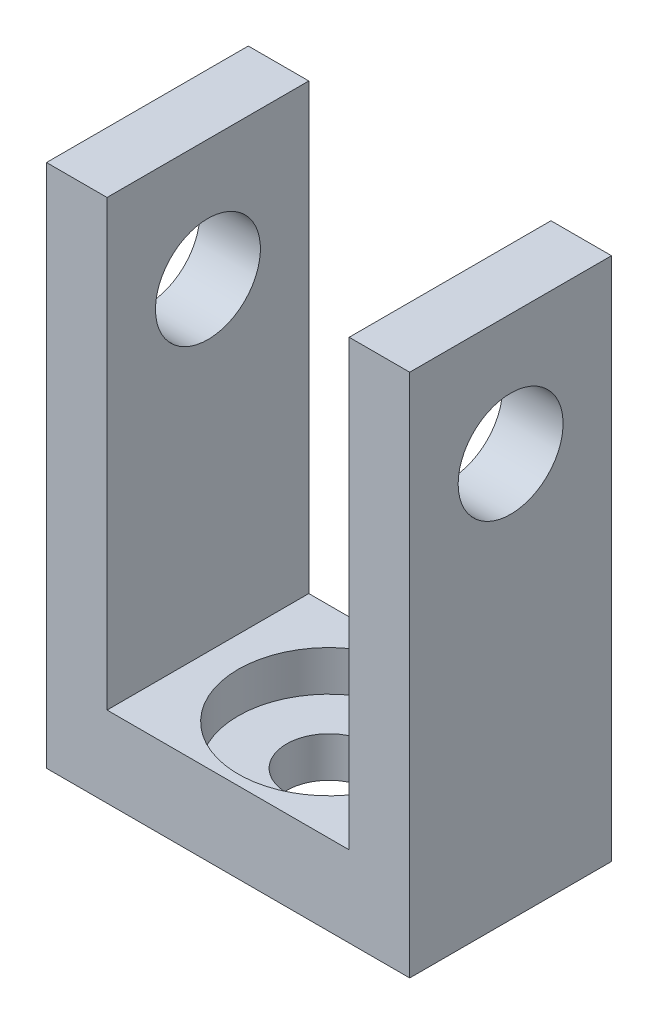
ISO-10303-21;
HEADER;
FILE_DESCRIPTION(('STEP AP214'),'2;1');
FILE_NAME('part.step','',(''),(''),'','','');
FILE_SCHEMA(('AUTOMOTIVE_DESIGN { 1 0 10303 214 1 1 1 1 }'));
ENDSEC;
DATA;
#1=APPLICATION_CONTEXT('core data for automotive mechanical design processes');
#2=APPLICATION_PROTOCOL_DEFINITION('international standard','automotive_design',2000,#1);
#3=PRODUCT_CONTEXT('',#1,'mechanical');
#4=PRODUCT('Part','Part','',(#3));
#5=PRODUCT_RELATED_PRODUCT_CATEGORY('part','',(#4));
#6=PRODUCT_DEFINITION_FORMATION('','',#4);
#7=PRODUCT_DEFINITION_CONTEXT('part definition',#1,'design');
#8=PRODUCT_DEFINITION('design','',#6,#7);
#9=PRODUCT_DEFINITION_SHAPE('','',#8);
#10=(LENGTH_UNIT() NAMED_UNIT(*) SI_UNIT(.MILLI.,.METRE.));
#11=(NAMED_UNIT(*) PLANE_ANGLE_UNIT() SI_UNIT($,.RADIAN.));
#12=(NAMED_UNIT(*) SI_UNIT($,.STERADIAN.) SOLID_ANGLE_UNIT());
#13=UNCERTAINTY_MEASURE_WITH_UNIT(LENGTH_MEASURE(1.E-05),#10,'distance_accuracy_value','');
#14=(GEOMETRIC_REPRESENTATION_CONTEXT(3) GLOBAL_UNCERTAINTY_ASSIGNED_CONTEXT((#13)) GLOBAL_UNIT_ASSIGNED_CONTEXT((#10,
#11,#12)) REPRESENTATION_CONTEXT('',''));
#15=CARTESIAN_POINT('',(0.,0.,0.));
#16=DIRECTION('',(0.,0.,1.));
#17=DIRECTION('',(1.,0.,0.));
#18=AXIS2_PLACEMENT_3D('',#15,#16,#17);
#19=CARTESIAN_POINT('',(0.,7.,5.));
#20=DIRECTION('',(0.,-1.,0.));
#21=DIRECTION('',(0.,0.,-1.));
#22=AXIS2_PLACEMENT_3D('',#19,#20,#21);
#23=CYLINDRICAL_SURFACE('',#22,2.1);
#24=CARTESIAN_POINT('',(0.,-2.,5.));
#25=DIRECTION('',(0.,1.,0.));
#26=DIRECTION('',(-1.,0.,0.));
#27=AXIS2_PLACEMENT_3D('',#24,#25,#26);
#28=CIRCLE('',#27,2.1);
#29=CARTESIAN_POINT('',(-2.1,-2.,5.));
#30=VERTEX_POINT('',#29);
#31=EDGE_CURVE('E43',#30,#30,#28,.F.);
#32=ORIENTED_EDGE('',*,*,#31,.F.);
#33=EDGE_LOOP('',(#32));
#34=FACE_BOUND('',#33,.T.);
#35=CARTESIAN_POINT('',(0.,-4.,5.));
#36=DIRECTION('',(0.,-1.,0.));
#37=DIRECTION('',(0.,0.,-1.));
#38=AXIS2_PLACEMENT_3D('',#35,#36,#37);
#39=CIRCLE('',#38,2.1);
#40=CARTESIAN_POINT('',(0.,-4.,2.9));
#41=VERTEX_POINT('',#40);
#42=EDGE_CURVE('E206',#41,#41,#39,.T.);
#43=ORIENTED_EDGE('',*,*,#42,.T.);
#44=EDGE_LOOP('',(#43));
#45=FACE_BOUND('',#44,.T.);
#46=ADVANCED_FACE('F39',(#34,#45),#23,.F.);
#47=CARTESIAN_POINT('',(9.,-3.,10.));
#48=DIRECTION('',(-1.,0.,0.));
#49=DIRECTION('',(0.,0.,1.));
#50=AXIS2_PLACEMENT_3D('',#47,#48,#49);
#51=PLANE('',#50);
#52=CARTESIAN_POINT('',(9.,16.,5.));
#53=DIRECTION('',(-1.,0.,0.));
#54=DIRECTION('',(0.,0.,1.));
#55=AXIS2_PLACEMENT_3D('',#52,#53,#54);
#56=CIRCLE('',#55,2.6);
#57=CARTESIAN_POINT('',(9.,16.,7.6));
#58=VERTEX_POINT('',#57);
#59=EDGE_CURVE('E134',#58,#58,#56,.T.);
#60=ORIENTED_EDGE('',*,*,#59,.T.);
#61=EDGE_LOOP('',(#60));
#62=FACE_BOUND('',#61,.T.);
#63=DIRECTION('',(0.,1.,0.));
#64=VECTOR('',#63,1.);
#65=CARTESIAN_POINT('',(9.,-3.,0.));
#66=LINE('',#65,#64);
#67=CARTESIAN_POINT('',(9.,-4.,0.));
#68=VERTEX_POINT('',#67);
#69=CARTESIAN_POINT('',(9.,22.,0.));
#70=VERTEX_POINT('',#69);
#71=EDGE_CURVE('E131',#68,#70,#66,.T.);
#72=ORIENTED_EDGE('',*,*,#71,.T.);
#73=DIRECTION('',(0.,0.,-1.));
#74=VECTOR('',#73,1.);
#75=CARTESIAN_POINT('',(9.,22.,10.));
#76=LINE('',#75,#74);
#77=CARTESIAN_POINT('',(9.,22.,10.));
#78=VERTEX_POINT('',#77);
#79=EDGE_CURVE('E11',#78,#70,#76,.T.);
#80=ORIENTED_EDGE('',*,*,#79,.F.);
#81=DIRECTION('',(0.,1.,0.));
#82=VECTOR('',#81,1.);
#83=CARTESIAN_POINT('',(9.,-3.,10.));
#84=LINE('',#83,#82);
#85=CARTESIAN_POINT('',(9.,-4.,10.));
#86=VERTEX_POINT('',#85);
#87=EDGE_CURVE('E95',#86,#78,#84,.T.);
#88=ORIENTED_EDGE('',*,*,#87,.F.);
#89=DIRECTION('',(0.,0.,1.));
#90=VECTOR('',#89,1.);
#91=CARTESIAN_POINT('',(9.,-4.,0.));
#92=LINE('',#91,#90);
#93=EDGE_CURVE('E181',#68,#86,#92,.T.);
#94=ORIENTED_EDGE('',*,*,#93,.F.);
#95=EDGE_LOOP('',(#72,#80,#88,#94));
#96=FACE_BOUND('',#95,.T.);
#97=ADVANCED_FACE('F41',(#62,#96),#51,.F.);
#98=CARTESIAN_POINT('',(5.99999999999999,22.,10.));
#99=DIRECTION('',(0.,-1.,0.));
#100=DIRECTION('',(0.,0.,-1.));
#101=AXIS2_PLACEMENT_3D('',#98,#99,#100);
#102=PLANE('',#101);
#103=DIRECTION('',(-1.,0.,0.));
#104=VECTOR('',#103,1.);
#105=CARTESIAN_POINT('',(5.99999999999999,22.,0.));
#106=LINE('',#105,#104);
#107=CARTESIAN_POINT('',(5.99999999999999,22.,0.));
#108=VERTEX_POINT('',#107);
#109=EDGE_CURVE('E133',#70,#108,#106,.T.);
#110=ORIENTED_EDGE('',*,*,#109,.T.);
#111=DIRECTION('',(0.,0.,-1.));
#112=VECTOR('',#111,1.);
#113=CARTESIAN_POINT('',(5.99999999999999,22.,10.));
#114=LINE('',#113,#112);
#115=CARTESIAN_POINT('',(5.99999999999999,22.,10.));
#116=VERTEX_POINT('',#115);
#117=EDGE_CURVE('E49',#116,#108,#114,.T.);
#118=ORIENTED_EDGE('',*,*,#117,.F.);
#119=DIRECTION('',(-1.,0.,0.));
#120=VECTOR('',#119,1.);
#121=CARTESIAN_POINT('',(5.99999999999999,22.,10.));
#122=LINE('',#121,#120);
#123=EDGE_CURVE('E204',#78,#116,#122,.T.);
#124=ORIENTED_EDGE('',*,*,#123,.F.);
#125=ORIENTED_EDGE('',*,*,#79,.T.);
#126=EDGE_LOOP('',(#110,#118,#124,#125));
#127=FACE_BOUND('',#126,.T.);
#128=ADVANCED_FACE('F205',(#127),#102,.F.);
#129=CARTESIAN_POINT('',(6.,0.,10.));
#130=DIRECTION('',(1.,0.,0.));
#131=DIRECTION('',(0.,1.,0.));
#132=AXIS2_PLACEMENT_3D('',#129,#130,#131);
#133=PLANE('',#132);
#134=CARTESIAN_POINT('',(5.99999999999999,16.,5.));
#135=DIRECTION('',(1.,0.,0.));
#136=DIRECTION('',(0.,1.,0.));
#137=AXIS2_PLACEMENT_3D('',#134,#135,#136);
#138=CIRCLE('',#137,2.6);
#139=CARTESIAN_POINT('',(5.99999999999999,18.6,5.));
#140=VERTEX_POINT('',#139);
#141=EDGE_CURVE('E198',#140,#140,#138,.T.);
#142=ORIENTED_EDGE('',*,*,#141,.T.);
#143=EDGE_LOOP('',(#142));
#144=FACE_BOUND('',#143,.T.);
#145=DIRECTION('',(0.,-1.,0.));
#146=VECTOR('',#145,1.);
#147=CARTESIAN_POINT('',(6.,0.,0.));
#148=LINE('',#147,#146);
#149=CARTESIAN_POINT('',(6.,0.,0.));
#150=VERTEX_POINT('',#149);
#151=EDGE_CURVE('E136',#108,#150,#148,.T.);
#152=ORIENTED_EDGE('',*,*,#151,.T.);
#153=DIRECTION('',(0.,0.,-1.));
#154=VECTOR('',#153,1.);
#155=CARTESIAN_POINT('',(6.,0.,10.));
#156=LINE('',#155,#154);
#157=CARTESIAN_POINT('',(6.,0.,10.));
#158=VERTEX_POINT('',#157);
#159=EDGE_CURVE('E120',#158,#150,#156,.T.);
#160=ORIENTED_EDGE('',*,*,#159,.F.);
#161=DIRECTION('',(0.,-1.,0.));
#162=VECTOR('',#161,1.);
#163=CARTESIAN_POINT('',(6.,0.,10.));
#164=LINE('',#163,#162);
#165=EDGE_CURVE('E111',#116,#158,#164,.T.);
#166=ORIENTED_EDGE('',*,*,#165,.F.);
#167=ORIENTED_EDGE('',*,*,#117,.T.);
#168=EDGE_LOOP('',(#152,#160,#166,#167));
#169=FACE_BOUND('',#168,.T.);
#170=ADVANCED_FACE('F151',(#144,#169),#133,.F.);
#171=CARTESIAN_POINT('',(-6.,0.,10.));
#172=DIRECTION('',(0.,-1.,0.));
#173=DIRECTION('',(1.,0.,0.));
#174=AXIS2_PLACEMENT_3D('',#171,#172,#173);
#175=PLANE('',#174);
#176=CARTESIAN_POINT('',(0.,0.,5.));
#177=DIRECTION('',(0.,1.,0.));
#178=DIRECTION('',(-1.,0.,0.));
#179=AXIS2_PLACEMENT_3D('',#176,#177,#178);
#180=CIRCLE('',#179,4.5);
#181=CARTESIAN_POINT('',(-4.5,0.,5.));
#182=VERTEX_POINT('',#181);
#183=EDGE_CURVE('E182',#182,#182,#180,.T.);
#184=ORIENTED_EDGE('',*,*,#183,.F.);
#185=EDGE_LOOP('',(#184));
#186=FACE_BOUND('',#185,.T.);
#187=DIRECTION('',(-1.,0.,0.));
#188=VECTOR('',#187,1.);
#189=CARTESIAN_POINT('',(-6.,0.,0.));
#190=LINE('',#189,#188);
#191=CARTESIAN_POINT('',(-6.,0.,0.));
#192=VERTEX_POINT('',#191);
#193=EDGE_CURVE('E119',#150,#192,#190,.T.);
#194=ORIENTED_EDGE('',*,*,#193,.T.);
#195=DIRECTION('',(0.,0.,-1.));
#196=VECTOR('',#195,1.);
#197=CARTESIAN_POINT('',(-6.,0.,10.));
#198=LINE('',#197,#196);
#199=CARTESIAN_POINT('',(-6.,0.,10.));
#200=VERTEX_POINT('',#199);
#201=EDGE_CURVE('E116',#200,#192,#198,.T.);
#202=ORIENTED_EDGE('',*,*,#201,.F.);
#203=DIRECTION('',(-1.,0.,0.));
#204=VECTOR('',#203,1.);
#205=CARTESIAN_POINT('',(-6.,0.,10.));
#206=LINE('',#205,#204);
#207=EDGE_CURVE('E105',#158,#200,#206,.T.);
#208=ORIENTED_EDGE('',*,*,#207,.F.);
#209=ORIENTED_EDGE('',*,*,#159,.T.);
#210=EDGE_LOOP('',(#194,#202,#208,#209));
#211=FACE_BOUND('',#210,.T.);
#212=ADVANCED_FACE('F117',(#186,#211),#175,.F.);
#213=CARTESIAN_POINT('',(-6.,0.,10.));
#214=DIRECTION('',(-1.,0.,0.));
#215=DIRECTION('',(0.,0.,1.));
#216=AXIS2_PLACEMENT_3D('',#213,#214,#215);
#217=PLANE('',#216);
#218=CARTESIAN_POINT('',(-6.,16.,5.));
#219=DIRECTION('',(-1.,0.,0.));
#220=DIRECTION('',(0.,0.,1.));
#221=AXIS2_PLACEMENT_3D('',#218,#219,#220);
#222=CIRCLE('',#221,2.6);
#223=CARTESIAN_POINT('',(-6.,16.,7.6));
#224=VERTEX_POINT('',#223);
#225=EDGE_CURVE('E195',#224,#224,#222,.T.);
#226=ORIENTED_EDGE('',*,*,#225,.T.);
#227=EDGE_LOOP('',(#226));
#228=FACE_BOUND('',#227,.T.);
#229=DIRECTION('',(0.,1.,0.));
#230=VECTOR('',#229,1.);
#231=CARTESIAN_POINT('',(-6.,0.,0.));
#232=LINE('',#231,#230);
#233=CARTESIAN_POINT('',(-6.,22.,0.));
#234=VERTEX_POINT('',#233);
#235=EDGE_CURVE('E81',#192,#234,#232,.T.);
#236=ORIENTED_EDGE('',*,*,#235,.T.);
#237=DIRECTION('',(0.,0.,-1.));
#238=VECTOR('',#237,1.);
#239=CARTESIAN_POINT('',(-6.,22.,10.));
#240=LINE('',#239,#238);
#241=CARTESIAN_POINT('',(-6.,22.,10.));
#242=VERTEX_POINT('',#241);
#243=EDGE_CURVE('E121',#242,#234,#240,.T.);
#244=ORIENTED_EDGE('',*,*,#243,.F.);
#245=DIRECTION('',(0.,1.,0.));
#246=VECTOR('',#245,1.);
#247=CARTESIAN_POINT('',(-6.,0.,10.));
#248=LINE('',#247,#246);
#249=EDGE_CURVE('E109',#200,#242,#248,.T.);
#250=ORIENTED_EDGE('',*,*,#249,.F.);
#251=ORIENTED_EDGE('',*,*,#201,.T.);
#252=EDGE_LOOP('',(#236,#244,#250,#251));
#253=FACE_BOUND('',#252,.T.);
#254=ADVANCED_FACE('F123',(#228,#253),#217,.F.);
#255=CARTESIAN_POINT('',(-6.,22.,10.));
#256=DIRECTION('',(0.,-1.,0.));
#257=DIRECTION('',(0.,0.,-1.));
#258=AXIS2_PLACEMENT_3D('',#255,#256,#257);
#259=PLANE('',#258);
#260=DIRECTION('',(-1.,0.,0.));
#261=VECTOR('',#260,1.);
#262=CARTESIAN_POINT('',(-6.,22.,0.));
#263=LINE('',#262,#261);
#264=CARTESIAN_POINT('',(-9.,22.,0.));
#265=VERTEX_POINT('',#264);
#266=EDGE_CURVE('E87',#234,#265,#263,.T.);
#267=ORIENTED_EDGE('',*,*,#266,.T.);
#268=DIRECTION('',(0.,0.,-1.));
#269=VECTOR('',#268,1.);
#270=CARTESIAN_POINT('',(-9.,22.,10.));
#271=LINE('',#270,#269);
#272=CARTESIAN_POINT('',(-9.,22.,10.));
#273=VERTEX_POINT('',#272);
#274=EDGE_CURVE('E130',#273,#265,#271,.T.);
#275=ORIENTED_EDGE('',*,*,#274,.F.);
#276=DIRECTION('',(-1.,0.,0.));
#277=VECTOR('',#276,1.);
#278=CARTESIAN_POINT('',(-6.,22.,10.));
#279=LINE('',#278,#277);
#280=EDGE_CURVE('E57',#242,#273,#279,.T.);
#281=ORIENTED_EDGE('',*,*,#280,.F.);
#282=ORIENTED_EDGE('',*,*,#243,.T.);
#283=EDGE_LOOP('',(#267,#275,#281,#282));
#284=FACE_BOUND('',#283,.T.);
#285=ADVANCED_FACE('F242',(#284),#259,.F.);
#286=CARTESIAN_POINT('',(-9.,-3.,10.));
#287=DIRECTION('',(1.,0.,0.));
#288=DIRECTION('',(0.,0.,-1.));
#289=AXIS2_PLACEMENT_3D('',#286,#287,#288);
#290=PLANE('',#289);
#291=CARTESIAN_POINT('',(-9.,16.,5.));
#292=DIRECTION('',(-1.,0.,0.));
#293=DIRECTION('',(0.,0.,1.));
#294=AXIS2_PLACEMENT_3D('',#291,#292,#293);
#295=CIRCLE('',#294,2.6);
#296=CARTESIAN_POINT('',(-9.,16.,7.6));
#297=VERTEX_POINT('',#296);
#298=EDGE_CURVE('E192',#297,#297,#295,.T.);
#299=ORIENTED_EDGE('',*,*,#298,.F.);
#300=EDGE_LOOP('',(#299));
#301=FACE_BOUND('',#300,.T.);
#302=DIRECTION('',(0.,-1.,0.));
#303=VECTOR('',#302,1.);
#304=CARTESIAN_POINT('',(-9.,-3.,0.));
#305=LINE('',#304,#303);
#306=CARTESIAN_POINT('',(-9.,-4.,0.));
#307=VERTEX_POINT('',#306);
#308=EDGE_CURVE('E141',#265,#307,#305,.T.);
#309=ORIENTED_EDGE('',*,*,#308,.T.);
#310=DIRECTION('',(0.,0.,-1.));
#311=VECTOR('',#310,1.);
#312=CARTESIAN_POINT('',(-9.,-4.,10.));
#313=LINE('',#312,#311);
#314=CARTESIAN_POINT('',(-9.,-4.,10.));
#315=VERTEX_POINT('',#314);
#316=EDGE_CURVE('E168',#315,#307,#313,.T.);
#317=ORIENTED_EDGE('',*,*,#316,.F.);
#318=DIRECTION('',(0.,-1.,0.));
#319=VECTOR('',#318,1.);
#320=CARTESIAN_POINT('',(-9.,-3.,10.));
#321=LINE('',#320,#319);
#322=EDGE_CURVE('E125',#273,#315,#321,.T.);
#323=ORIENTED_EDGE('',*,*,#322,.F.);
#324=ORIENTED_EDGE('',*,*,#274,.T.);
#325=EDGE_LOOP('',(#309,#317,#323,#324));
#326=FACE_BOUND('',#325,.T.);
#327=ADVANCED_FACE('F166',(#301,#326),#290,.F.);
#328=CARTESIAN_POINT('',(0.,0.,10.));
#329=DIRECTION('',(0.,0.,1.));
#330=DIRECTION('',(1.,0.,0.));
#331=AXIS2_PLACEMENT_3D('',#328,#329,#330);
#332=PLANE('',#331);
#333=ORIENTED_EDGE('',*,*,#322,.T.);
#334=DIRECTION('',(-1.,0.,0.));
#335=VECTOR('',#334,1.);
#336=CARTESIAN_POINT('',(9.,-4.,10.));
#337=LINE('',#336,#335);
#338=EDGE_CURVE('E177',#86,#315,#337,.T.);
#339=ORIENTED_EDGE('',*,*,#338,.F.);
#340=ORIENTED_EDGE('',*,*,#87,.T.);
#341=ORIENTED_EDGE('',*,*,#123,.T.);
#342=ORIENTED_EDGE('',*,*,#165,.T.);
#343=ORIENTED_EDGE('',*,*,#207,.T.);
#344=ORIENTED_EDGE('',*,*,#249,.T.);
#345=ORIENTED_EDGE('',*,*,#280,.T.);
#346=EDGE_LOOP('',(#333,#339,#340,#341,#342,#343,#344,#345));
#347=FACE_BOUND('',#346,.T.);
#348=ADVANCED_FACE('F107',(#347),#332,.T.);
#349=CARTESIAN_POINT('',(0.,0.,0.));
#350=DIRECTION('',(0.,0.,1.));
#351=DIRECTION('',(1.,0.,0.));
#352=AXIS2_PLACEMENT_3D('',#349,#350,#351);
#353=PLANE('',#352);
#354=ORIENTED_EDGE('',*,*,#71,.F.);
#355=DIRECTION('',(1.,0.,0.));
#356=VECTOR('',#355,1.);
#357=CARTESIAN_POINT('',(-9.,-4.,0.));
#358=LINE('',#357,#356);
#359=EDGE_CURVE('E162',#307,#68,#358,.T.);
#360=ORIENTED_EDGE('',*,*,#359,.F.);
#361=ORIENTED_EDGE('',*,*,#308,.F.);
#362=ORIENTED_EDGE('',*,*,#266,.F.);
#363=ORIENTED_EDGE('',*,*,#235,.F.);
#364=ORIENTED_EDGE('',*,*,#193,.F.);
#365=ORIENTED_EDGE('',*,*,#151,.F.);
#366=ORIENTED_EDGE('',*,*,#109,.F.);
#367=EDGE_LOOP('',(#354,#360,#361,#362,#363,#364,#365,#366));
#368=FACE_BOUND('',#367,.T.);
#369=ADVANCED_FACE('F157',(#368),#353,.F.);
#370=CARTESIAN_POINT('',(16.,16.,5.));
#371=DIRECTION('',(-1.,0.,0.));
#372=DIRECTION('',(0.,0.,1.));
#373=AXIS2_PLACEMENT_3D('',#370,#371,#372);
#374=CYLINDRICAL_SURFACE('',#373,2.6);
#375=ORIENTED_EDGE('',*,*,#298,.T.);
#376=EDGE_LOOP('',(#375));
#377=FACE_BOUND('',#376,.T.);
#378=ORIENTED_EDGE('',*,*,#225,.F.);
#379=EDGE_LOOP('',(#378));
#380=FACE_BOUND('',#379,.T.);
#381=ADVANCED_FACE('F234',(#377,#380),#374,.F.);
#382=ORIENTED_EDGE('',*,*,#141,.F.);
#383=EDGE_LOOP('',(#382));
#384=FACE_BOUND('',#383,.T.);
#385=ORIENTED_EDGE('',*,*,#59,.F.);
#386=EDGE_LOOP('',(#385));
#387=FACE_BOUND('',#386,.T.);
#388=ADVANCED_FACE('F231',(#384,#387),#374,.F.);
#389=CARTESIAN_POINT('',(0.,-2.,5.));
#390=DIRECTION('',(0.,1.,0.));
#391=DIRECTION('',(-1.,0.,0.));
#392=AXIS2_PLACEMENT_3D('',#389,#390,#391);
#393=PLANE('',#392);
#394=CARTESIAN_POINT('',(0.,-2.,5.));
#395=DIRECTION('',(0.,1.,0.));
#396=DIRECTION('',(-1.,0.,0.));
#397=AXIS2_PLACEMENT_3D('',#394,#395,#396);
#398=CIRCLE('',#397,4.5);
#399=CARTESIAN_POINT('',(-4.5,-2.,5.));
#400=VERTEX_POINT('',#399);
#401=EDGE_CURVE('E185',#400,#400,#398,.T.);
#402=ORIENTED_EDGE('',*,*,#401,.T.);
#403=EDGE_LOOP('',(#402));
#404=FACE_BOUND('',#403,.T.);
#405=ORIENTED_EDGE('',*,*,#31,.T.);
#406=EDGE_LOOP('',(#405));
#407=FACE_BOUND('',#406,.T.);
#408=ADVANCED_FACE('F218',(#404,#407),#393,.T.);
#409=CARTESIAN_POINT('',(0.,-2.,5.));
#410=DIRECTION('',(0.,1.,0.));
#411=DIRECTION('',(-1.,0.,0.));
#412=AXIS2_PLACEMENT_3D('',#409,#410,#411);
#413=CYLINDRICAL_SURFACE('',#412,4.5);
#414=ORIENTED_EDGE('',*,*,#401,.F.);
#415=EDGE_LOOP('',(#414));
#416=FACE_BOUND('',#415,.T.);
#417=ORIENTED_EDGE('',*,*,#183,.T.);
#418=EDGE_LOOP('',(#417));
#419=FACE_BOUND('',#418,.T.);
#420=ADVANCED_FACE('F213',(#416,#419),#413,.F.);
#421=CARTESIAN_POINT('',(0.,-4.,0.));
#422=DIRECTION('',(0.,-1.,0.));
#423=DIRECTION('',(0.,0.,-1.));
#424=AXIS2_PLACEMENT_3D('',#421,#422,#423);
#425=PLANE('',#424);
#426=ORIENTED_EDGE('',*,*,#316,.T.);
#427=ORIENTED_EDGE('',*,*,#359,.T.);
#428=ORIENTED_EDGE('',*,*,#93,.T.);
#429=ORIENTED_EDGE('',*,*,#338,.T.);
#430=EDGE_LOOP('',(#426,#427,#428,#429));
#431=FACE_BOUND('',#430,.T.);
#432=ORIENTED_EDGE('',*,*,#42,.F.);
#433=EDGE_LOOP('',(#432));
#434=FACE_BOUND('',#433,.T.);
#435=ADVANCED_FACE('F179',(#431,#434),#425,.T.);
#436=CLOSED_SHELL('',(#46,#97,#128,#170,#212,#254,#285,#327,#348,#369,#381,#388,#408,#420,#435));
#437=MANIFOLD_SOLID_BREP('B2',#436);
#438=ADVANCED_BREP_SHAPE_REPRESENTATION('',(#18,#437),#14);
#439=SHAPE_DEFINITION_REPRESENTATION(#9,#438);
ENDSEC;
END-ISO-10303-21;
